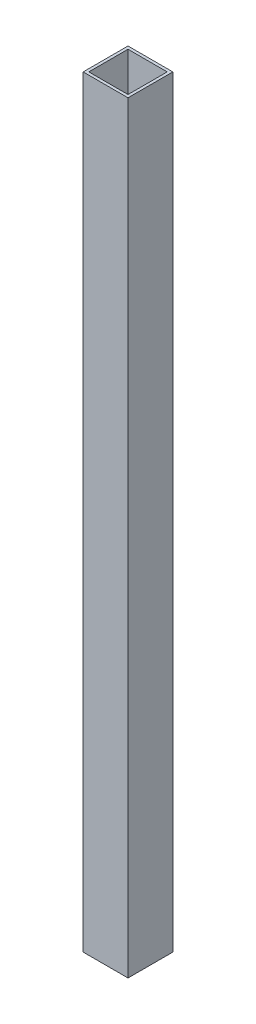
ISO-10303-21;
HEADER;
FILE_DESCRIPTION(('STEP AP214'),'2;1');
FILE_NAME('part.step','',(''),(''),'','','');
FILE_SCHEMA(('AUTOMOTIVE_DESIGN { 1 0 10303 214 1 1 1 1 }'));
ENDSEC;
DATA;
#1=APPLICATION_CONTEXT('core data for automotive mechanical design processes');
#2=APPLICATION_PROTOCOL_DEFINITION('international standard','automotive_design',2000,#1);
#3=PRODUCT_CONTEXT('',#1,'mechanical');
#4=PRODUCT('Part','Part','',(#3));
#5=PRODUCT_RELATED_PRODUCT_CATEGORY('part','',(#4));
#6=PRODUCT_DEFINITION_FORMATION('','',#4);
#7=PRODUCT_DEFINITION_CONTEXT('part definition',#1,'design');
#8=PRODUCT_DEFINITION('design','',#6,#7);
#9=PRODUCT_DEFINITION_SHAPE('','',#8);
#10=(LENGTH_UNIT() NAMED_UNIT(*) SI_UNIT(.MILLI.,.METRE.));
#11=(NAMED_UNIT(*) PLANE_ANGLE_UNIT() SI_UNIT($,.RADIAN.));
#12=(NAMED_UNIT(*) SI_UNIT($,.STERADIAN.) SOLID_ANGLE_UNIT());
#13=UNCERTAINTY_MEASURE_WITH_UNIT(LENGTH_MEASURE(1.E-05),#10,'distance_accuracy_value','');
#14=(GEOMETRIC_REPRESENTATION_CONTEXT(3) GLOBAL_UNCERTAINTY_ASSIGNED_CONTEXT((#13)) GLOBAL_UNIT_ASSIGNED_CONTEXT((#10,
#11,#12)) REPRESENTATION_CONTEXT('',''));
#15=CARTESIAN_POINT('',(0.,0.,0.));
#16=DIRECTION('',(0.,0.,1.));
#17=DIRECTION('',(1.,0.,0.));
#18=AXIS2_PLACEMENT_3D('',#15,#16,#17);
#19=CARTESIAN_POINT('',(0.,431.8,0.));
#20=DIRECTION('',(0.,-1.,0.));
#21=DIRECTION('',(0.,0.,-1.));
#22=AXIS2_PLACEMENT_3D('',#19,#20,#21);
#23=PLANE('',#22);
#24=DIRECTION('',(0.,0.,1.));
#25=VECTOR('',#24,1.);
#26=CARTESIAN_POINT('',(-12.7,431.8,-12.7));
#27=LINE('',#26,#25);
#28=CARTESIAN_POINT('',(-12.7,431.8,-12.7));
#29=VERTEX_POINT('',#28);
#30=CARTESIAN_POINT('',(-12.7,431.8,12.7));
#31=VERTEX_POINT('',#30);
#32=EDGE_CURVE('E136',#29,#31,#27,.T.);
#33=ORIENTED_EDGE('',*,*,#32,.T.);
#34=DIRECTION('',(1.,0.,0.));
#35=VECTOR('',#34,1.);
#36=CARTESIAN_POINT('',(12.7,431.8,12.7));
#37=LINE('',#36,#35);
#38=CARTESIAN_POINT('',(12.7,431.8,12.7));
#39=VERTEX_POINT('',#38);
#40=EDGE_CURVE('E139',#31,#39,#37,.T.);
#41=ORIENTED_EDGE('',*,*,#40,.T.);
#42=DIRECTION('',(0.,0.,-1.));
#43=VECTOR('',#42,1.);
#44=CARTESIAN_POINT('',(12.7,431.8,-12.7));
#45=LINE('',#44,#43);
#46=CARTESIAN_POINT('',(12.7,431.8,-12.7));
#47=VERTEX_POINT('',#46);
#48=EDGE_CURVE('E142',#39,#47,#45,.T.);
#49=ORIENTED_EDGE('',*,*,#48,.T.);
#50=DIRECTION('',(-1.,0.,0.));
#51=VECTOR('',#50,1.);
#52=CARTESIAN_POINT('',(12.7,431.8,-12.7));
#53=LINE('',#52,#51);
#54=EDGE_CURVE('E144',#47,#29,#53,.T.);
#55=ORIENTED_EDGE('',*,*,#54,.T.);
#56=EDGE_LOOP('',(#33,#41,#49,#55));
#57=FACE_BOUND('',#56,.T.);
#58=DIRECTION('',(0.,0.,1.));
#59=VECTOR('',#58,1.);
#60=CARTESIAN_POINT('',(-11.1125,431.8,-11.1125));
#61=LINE('',#60,#59);
#62=CARTESIAN_POINT('',(-11.1125,431.8,-11.1125));
#63=VERTEX_POINT('',#62);
#64=CARTESIAN_POINT('',(-11.1125,431.8,11.1125));
#65=VERTEX_POINT('',#64);
#66=EDGE_CURVE('E100',#63,#65,#61,.T.);
#67=ORIENTED_EDGE('',*,*,#66,.F.);
#68=DIRECTION('',(-1.,0.,0.));
#69=VECTOR('',#68,1.);
#70=CARTESIAN_POINT('',(11.1125,431.8,-11.1125));
#71=LINE('',#70,#69);
#72=CARTESIAN_POINT('',(11.1125,431.8,-11.1125));
#73=VERTEX_POINT('',#72);
#74=EDGE_CURVE('E122',#73,#63,#71,.T.);
#75=ORIENTED_EDGE('',*,*,#74,.F.);
#76=DIRECTION('',(0.,0.,-1.));
#77=VECTOR('',#76,1.);
#78=CARTESIAN_POINT('',(11.1125,431.8,-11.1125));
#79=LINE('',#78,#77);
#80=CARTESIAN_POINT('',(11.1125,431.8,11.1125));
#81=VERTEX_POINT('',#80);
#82=EDGE_CURVE('E120',#81,#73,#79,.T.);
#83=ORIENTED_EDGE('',*,*,#82,.F.);
#84=DIRECTION('',(1.,0.,0.));
#85=VECTOR('',#84,1.);
#86=CARTESIAN_POINT('',(11.1125,431.8,11.1125));
#87=LINE('',#86,#85);
#88=EDGE_CURVE('E108',#65,#81,#87,.T.);
#89=ORIENTED_EDGE('',*,*,#88,.F.);
#90=EDGE_LOOP('',(#67,#75,#83,#89));
#91=FACE_BOUND('',#90,.T.);
#92=ADVANCED_FACE('F35',(#57,#91),#23,.F.);
#93=CARTESIAN_POINT('',(0.,0.,0.));
#94=DIRECTION('',(0.,-1.,0.));
#95=DIRECTION('',(0.,0.,-1.));
#96=AXIS2_PLACEMENT_3D('',#93,#94,#95);
#97=PLANE('',#96);
#98=DIRECTION('',(0.,0.,1.));
#99=VECTOR('',#98,1.);
#100=CARTESIAN_POINT('',(-12.7,0.,-12.7));
#101=LINE('',#100,#99);
#102=CARTESIAN_POINT('',(-12.7,0.,-12.7));
#103=VERTEX_POINT('',#102);
#104=CARTESIAN_POINT('',(-12.7,0.,12.7));
#105=VERTEX_POINT('',#104);
#106=EDGE_CURVE('E116',#103,#105,#101,.T.);
#107=ORIENTED_EDGE('',*,*,#106,.F.);
#108=DIRECTION('',(-1.,0.,0.));
#109=VECTOR('',#108,1.);
#110=CARTESIAN_POINT('',(12.7,0.,-12.7));
#111=LINE('',#110,#109);
#112=CARTESIAN_POINT('',(12.7,0.,-12.7));
#113=VERTEX_POINT('',#112);
#114=EDGE_CURVE('E140',#113,#103,#111,.T.);
#115=ORIENTED_EDGE('',*,*,#114,.F.);
#116=DIRECTION('',(0.,0.,-1.));
#117=VECTOR('',#116,1.);
#118=CARTESIAN_POINT('',(12.7,0.,-12.7));
#119=LINE('',#118,#117);
#120=CARTESIAN_POINT('',(12.7,0.,12.7));
#121=VERTEX_POINT('',#120);
#122=EDGE_CURVE('E151',#121,#113,#119,.T.);
#123=ORIENTED_EDGE('',*,*,#122,.F.);
#124=DIRECTION('',(1.,0.,0.));
#125=VECTOR('',#124,1.);
#126=CARTESIAN_POINT('',(12.7,0.,12.7));
#127=LINE('',#126,#125);
#128=EDGE_CURVE('E149',#105,#121,#127,.T.);
#129=ORIENTED_EDGE('',*,*,#128,.F.);
#130=EDGE_LOOP('',(#107,#115,#123,#129));
#131=FACE_BOUND('',#130,.T.);
#132=DIRECTION('',(-1.,0.,0.));
#133=VECTOR('',#132,1.);
#134=CARTESIAN_POINT('',(11.1125,0.,-11.1125));
#135=LINE('',#134,#133);
#136=CARTESIAN_POINT('',(11.1125,0.,-11.1125));
#137=VERTEX_POINT('',#136);
#138=CARTESIAN_POINT('',(-11.1125,0.,-11.1125));
#139=VERTEX_POINT('',#138);
#140=EDGE_CURVE('E109',#137,#139,#135,.T.);
#141=ORIENTED_EDGE('',*,*,#140,.T.);
#142=DIRECTION('',(0.,0.,1.));
#143=VECTOR('',#142,1.);
#144=CARTESIAN_POINT('',(-11.1125,0.,-11.1125));
#145=LINE('',#144,#143);
#146=CARTESIAN_POINT('',(-11.1125,0.,11.1125));
#147=VERTEX_POINT('',#146);
#148=EDGE_CURVE('E58',#139,#147,#145,.T.);
#149=ORIENTED_EDGE('',*,*,#148,.T.);
#150=DIRECTION('',(1.,0.,0.));
#151=VECTOR('',#150,1.);
#152=CARTESIAN_POINT('',(11.1125,0.,11.1125));
#153=LINE('',#152,#151);
#154=CARTESIAN_POINT('',(11.1125,0.,11.1125));
#155=VERTEX_POINT('',#154);
#156=EDGE_CURVE('E115',#147,#155,#153,.T.);
#157=ORIENTED_EDGE('',*,*,#156,.T.);
#158=DIRECTION('',(0.,0.,-1.));
#159=VECTOR('',#158,1.);
#160=CARTESIAN_POINT('',(11.1125,0.,-11.1125));
#161=LINE('',#160,#159);
#162=EDGE_CURVE('E128',#155,#137,#161,.T.);
#163=ORIENTED_EDGE('',*,*,#162,.T.);
#164=EDGE_LOOP('',(#141,#149,#157,#163));
#165=FACE_BOUND('',#164,.T.);
#166=ADVANCED_FACE('F169',(#131,#165),#97,.T.);
#167=CARTESIAN_POINT('',(-12.7,431.8,-12.7));
#168=DIRECTION('',(1.,0.,0.));
#169=DIRECTION('',(0.,0.,-1.));
#170=AXIS2_PLACEMENT_3D('',#167,#168,#169);
#171=PLANE('',#170);
#172=ORIENTED_EDGE('',*,*,#106,.T.);
#173=DIRECTION('',(0.,-1.,0.));
#174=VECTOR('',#173,1.);
#175=CARTESIAN_POINT('',(-12.7,431.8,12.7));
#176=LINE('',#175,#174);
#177=EDGE_CURVE('E11',#31,#105,#176,.T.);
#178=ORIENTED_EDGE('',*,*,#177,.F.);
#179=ORIENTED_EDGE('',*,*,#32,.F.);
#180=DIRECTION('',(0.,-1.,0.));
#181=VECTOR('',#180,1.);
#182=CARTESIAN_POINT('',(-12.7,431.8,-12.7));
#183=LINE('',#182,#181);
#184=EDGE_CURVE('E146',#29,#103,#183,.T.);
#185=ORIENTED_EDGE('',*,*,#184,.T.);
#186=EDGE_LOOP('',(#172,#178,#179,#185));
#187=FACE_BOUND('',#186,.T.);
#188=ADVANCED_FACE('F37',(#187),#171,.F.);
#189=CARTESIAN_POINT('',(12.7,431.8,12.7));
#190=DIRECTION('',(0.,0.,-1.));
#191=DIRECTION('',(-1.,0.,0.));
#192=AXIS2_PLACEMENT_3D('',#189,#190,#191);
#193=PLANE('',#192);
#194=ORIENTED_EDGE('',*,*,#128,.T.);
#195=DIRECTION('',(0.,-1.,0.));
#196=VECTOR('',#195,1.);
#197=CARTESIAN_POINT('',(12.7,431.8,12.7));
#198=LINE('',#197,#196);
#199=EDGE_CURVE('E43',#39,#121,#198,.T.);
#200=ORIENTED_EDGE('',*,*,#199,.F.);
#201=ORIENTED_EDGE('',*,*,#40,.F.);
#202=ORIENTED_EDGE('',*,*,#177,.T.);
#203=EDGE_LOOP('',(#194,#200,#201,#202));
#204=FACE_BOUND('',#203,.T.);
#205=ADVANCED_FACE('F179',(#204),#193,.F.);
#206=CARTESIAN_POINT('',(12.7,431.8,-12.7));
#207=DIRECTION('',(-1.,0.,0.));
#208=DIRECTION('',(0.,0.,1.));
#209=AXIS2_PLACEMENT_3D('',#206,#207,#208);
#210=PLANE('',#209);
#211=ORIENTED_EDGE('',*,*,#122,.T.);
#212=DIRECTION('',(0.,-1.,0.));
#213=VECTOR('',#212,1.);
#214=CARTESIAN_POINT('',(12.7,431.8,-12.7));
#215=LINE('',#214,#213);
#216=EDGE_CURVE('E156',#47,#113,#215,.T.);
#217=ORIENTED_EDGE('',*,*,#216,.F.);
#218=ORIENTED_EDGE('',*,*,#48,.F.);
#219=ORIENTED_EDGE('',*,*,#199,.T.);
#220=EDGE_LOOP('',(#211,#217,#218,#219));
#221=FACE_BOUND('',#220,.T.);
#222=ADVANCED_FACE('F163',(#221),#210,.F.);
#223=CARTESIAN_POINT('',(12.7,431.8,-12.7));
#224=DIRECTION('',(0.,0.,1.));
#225=DIRECTION('',(1.,0.,0.));
#226=AXIS2_PLACEMENT_3D('',#223,#224,#225);
#227=PLANE('',#226);
#228=ORIENTED_EDGE('',*,*,#114,.T.);
#229=ORIENTED_EDGE('',*,*,#184,.F.);
#230=ORIENTED_EDGE('',*,*,#54,.F.);
#231=ORIENTED_EDGE('',*,*,#216,.T.);
#232=EDGE_LOOP('',(#228,#229,#230,#231));
#233=FACE_BOUND('',#232,.T.);
#234=ADVANCED_FACE('F173',(#233),#227,.F.);
#235=CARTESIAN_POINT('',(-11.1125,431.8,-11.1125));
#236=DIRECTION('',(1.,0.,0.));
#237=DIRECTION('',(0.,0.,-1.));
#238=AXIS2_PLACEMENT_3D('',#235,#236,#237);
#239=PLANE('',#238);
#240=ORIENTED_EDGE('',*,*,#148,.F.);
#241=DIRECTION('',(0.,-1.,0.));
#242=VECTOR('',#241,1.);
#243=CARTESIAN_POINT('',(-11.1125,431.8,-11.1125));
#244=LINE('',#243,#242);
#245=EDGE_CURVE('E104',#63,#139,#244,.T.);
#246=ORIENTED_EDGE('',*,*,#245,.F.);
#247=ORIENTED_EDGE('',*,*,#66,.T.);
#248=DIRECTION('',(0.,-1.,0.));
#249=VECTOR('',#248,1.);
#250=CARTESIAN_POINT('',(-11.1125,431.8,11.1125));
#251=LINE('',#250,#249);
#252=EDGE_CURVE('E103',#65,#147,#251,.T.);
#253=ORIENTED_EDGE('',*,*,#252,.T.);
#254=EDGE_LOOP('',(#240,#246,#247,#253));
#255=FACE_BOUND('',#254,.T.);
#256=ADVANCED_FACE('F102',(#255),#239,.T.);
#257=CARTESIAN_POINT('',(11.1125,431.8,11.1125));
#258=DIRECTION('',(0.,0.,-1.));
#259=DIRECTION('',(-1.,0.,0.));
#260=AXIS2_PLACEMENT_3D('',#257,#258,#259);
#261=PLANE('',#260);
#262=ORIENTED_EDGE('',*,*,#156,.F.);
#263=ORIENTED_EDGE('',*,*,#252,.F.);
#264=ORIENTED_EDGE('',*,*,#88,.T.);
#265=DIRECTION('',(0.,-1.,0.));
#266=VECTOR('',#265,1.);
#267=CARTESIAN_POINT('',(11.1125,431.8,11.1125));
#268=LINE('',#267,#266);
#269=EDGE_CURVE('E117',#81,#155,#268,.T.);
#270=ORIENTED_EDGE('',*,*,#269,.T.);
#271=EDGE_LOOP('',(#262,#263,#264,#270));
#272=FACE_BOUND('',#271,.T.);
#273=ADVANCED_FACE('F112',(#272),#261,.T.);
#274=CARTESIAN_POINT('',(11.1125,431.8,-11.1125));
#275=DIRECTION('',(-1.,0.,0.));
#276=DIRECTION('',(0.,0.,1.));
#277=AXIS2_PLACEMENT_3D('',#274,#275,#276);
#278=PLANE('',#277);
#279=ORIENTED_EDGE('',*,*,#162,.F.);
#280=ORIENTED_EDGE('',*,*,#269,.F.);
#281=ORIENTED_EDGE('',*,*,#82,.T.);
#282=DIRECTION('',(0.,-1.,0.));
#283=VECTOR('',#282,1.);
#284=CARTESIAN_POINT('',(11.1125,431.8,-11.1125));
#285=LINE('',#284,#283);
#286=EDGE_CURVE('E50',#73,#137,#285,.T.);
#287=ORIENTED_EDGE('',*,*,#286,.T.);
#288=EDGE_LOOP('',(#279,#280,#281,#287));
#289=FACE_BOUND('',#288,.T.);
#290=ADVANCED_FACE('F202',(#289),#278,.T.);
#291=CARTESIAN_POINT('',(11.1125,431.8,-11.1125));
#292=DIRECTION('',(0.,0.,1.));
#293=DIRECTION('',(1.,0.,0.));
#294=AXIS2_PLACEMENT_3D('',#291,#292,#293);
#295=PLANE('',#294);
#296=ORIENTED_EDGE('',*,*,#140,.F.);
#297=ORIENTED_EDGE('',*,*,#286,.F.);
#298=ORIENTED_EDGE('',*,*,#74,.T.);
#299=ORIENTED_EDGE('',*,*,#245,.T.);
#300=EDGE_LOOP('',(#296,#297,#298,#299));
#301=FACE_BOUND('',#300,.T.);
#302=ADVANCED_FACE('F206',(#301),#295,.T.);
#303=CLOSED_SHELL('',(#92,#166,#188,#205,#222,#234,#256,#273,#290,#302));
#304=MANIFOLD_SOLID_BREP('B2',#303);
#305=ADVANCED_BREP_SHAPE_REPRESENTATION('',(#18,#304),#14);
#306=SHAPE_DEFINITION_REPRESENTATION(#9,#305);
ENDSEC;
END-ISO-10303-21;
